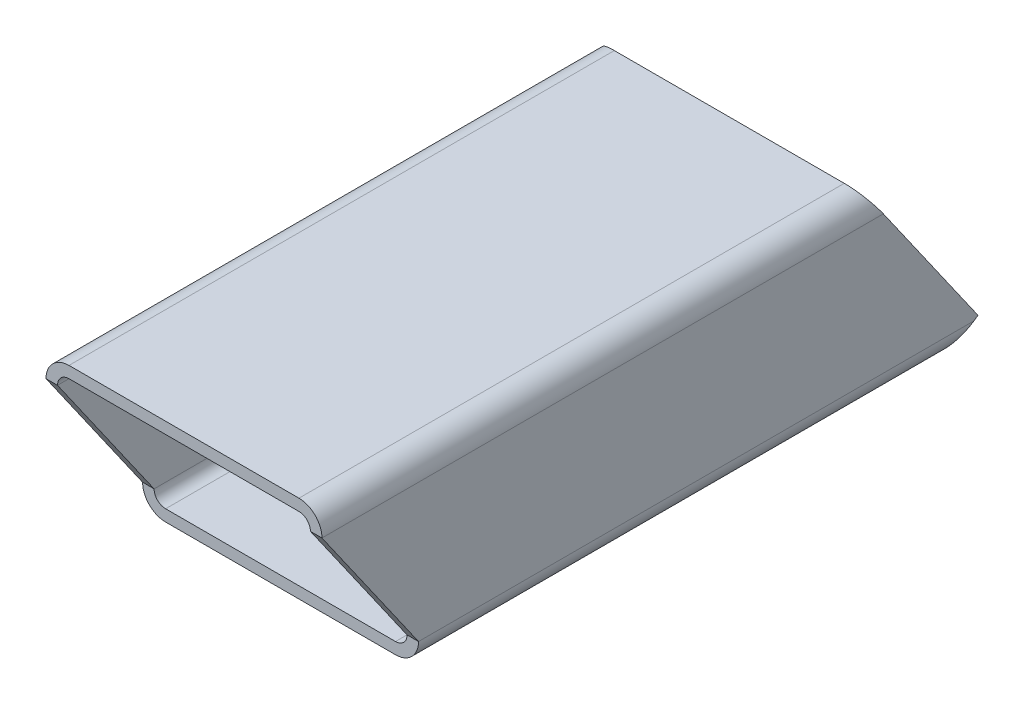
ISO-10303-21;
HEADER;
FILE_DESCRIPTION(('STEP AP214'),'2;1');
FILE_NAME('part.step','',(''),(''),'','','');
FILE_SCHEMA(('AUTOMOTIVE_DESIGN { 1 0 10303 214 1 1 1 1 }'));
ENDSEC;
DATA;
#1=APPLICATION_CONTEXT('core data for automotive mechanical design processes');
#2=APPLICATION_PROTOCOL_DEFINITION('international standard','automotive_design',2000,#1);
#3=PRODUCT_CONTEXT('',#1,'mechanical');
#4=PRODUCT('Part','Part','',(#3));
#5=PRODUCT_RELATED_PRODUCT_CATEGORY('part','',(#4));
#6=PRODUCT_DEFINITION_FORMATION('','',#4);
#7=PRODUCT_DEFINITION_CONTEXT('part definition',#1,'design');
#8=PRODUCT_DEFINITION('design','',#6,#7);
#9=PRODUCT_DEFINITION_SHAPE('','',#8);
#10=(LENGTH_UNIT() NAMED_UNIT(*) SI_UNIT(.MILLI.,.METRE.));
#11=(NAMED_UNIT(*) PLANE_ANGLE_UNIT() SI_UNIT($,.RADIAN.));
#12=(NAMED_UNIT(*) SI_UNIT($,.STERADIAN.) SOLID_ANGLE_UNIT());
#13=UNCERTAINTY_MEASURE_WITH_UNIT(LENGTH_MEASURE(1.E-05),#10,'distance_accuracy_value','');
#14=(GEOMETRIC_REPRESENTATION_CONTEXT(3) GLOBAL_UNCERTAINTY_ASSIGNED_CONTEXT((#13)) GLOBAL_UNIT_ASSIGNED_CONTEXT((#10,
#11,#12)) REPRESENTATION_CONTEXT('',''));
#15=CARTESIAN_POINT('',(0.,0.,0.));
#16=DIRECTION('',(0.,0.,1.));
#17=DIRECTION('',(1.,0.,0.));
#18=AXIS2_PLACEMENT_3D('',#15,#16,#17);
#19=CARTESIAN_POINT('',(63.5,-38.1,215.9));
#20=DIRECTION('',(0.,0.,-1.));
#21=DIRECTION('',(-1.,0.,0.));
#22=AXIS2_PLACEMENT_3D('',#19,#20,#21);
#23=CYLINDRICAL_SURFACE('',#22,12.7);
#24=DIRECTION('',(0.,0.,-1.));
#25=VECTOR('',#24,1.);
#26=CARTESIAN_POINT('',(63.5,-50.8,215.9));
#27=LINE('',#26,#25);
#28=CARTESIAN_POINT('',(63.5,-50.8,159.369185588421));
#29=VERTEX_POINT('',#28);
#30=CARTESIAN_POINT('',(63.5,-50.8,-129.26596489524));
#31=VERTEX_POINT('',#30);
#32=EDGE_CURVE('E240',#29,#31,#27,.T.);
#33=ORIENTED_EDGE('',*,*,#32,.T.);
#34=CARTESIAN_POINT('',(63.5,-38.1,-147.403444580865));
#35=DIRECTION('',(0.,0.819152044288994,0.573576436351042));
#36=DIRECTION('',(0.,0.573576436351042,-0.819152044288995));
#37=AXIS2_PLACEMENT_3D('',#34,#35,#36);
#38=ELLIPSE('',#37,22.1417743043881,12.7);
#39=CARTESIAN_POINT('',(76.2,-38.1,-147.403444580865));
#40=VERTEX_POINT('',#39);
#41=EDGE_CURVE('E305',#31,#40,#38,.T.);
#42=ORIENTED_EDGE('',*,*,#41,.T.);
#43=DIRECTION('',(0.,0.,-1.));
#44=VECTOR('',#43,1.);
#45=CARTESIAN_POINT('',(76.2,-38.1,215.9));
#46=LINE('',#45,#44);
#47=CARTESIAN_POINT('',(76.2,-38.1,159.369185588421));
#48=VERTEX_POINT('',#47);
#49=EDGE_CURVE('E255',#48,#40,#46,.T.);
#50=ORIENTED_EDGE('',*,*,#49,.F.);
#51=CARTESIAN_POINT('',(63.5,-38.1,159.369185588421));
#52=DIRECTION('',(0.,0.,-1.));
#53=DIRECTION('',(0.,1.,0.));
#54=AXIS2_PLACEMENT_3D('',#51,#52,#53);
#55=CIRCLE('',#54,12.7);
#56=EDGE_CURVE('E386',#48,#29,#55,.T.);
#57=ORIENTED_EDGE('',*,*,#56,.T.);
#58=EDGE_LOOP('',(#33,#42,#50,#57));
#59=FACE_BOUND('',#58,.T.);
#60=ADVANCED_FACE('F47',(#59),#23,.T.);
#61=CARTESIAN_POINT('',(76.2,-38.1,215.9));
#62=DIRECTION('',(-1.,0.,0.));
#63=DIRECTION('',(0.,0.,1.));
#64=AXIS2_PLACEMENT_3D('',#61,#62,#63);
#65=PLANE('',#64);
#66=ORIENTED_EDGE('',*,*,#49,.T.);
#67=DIRECTION('',(0.,0.573576436351042,-0.819152044288995));
#68=VECTOR('',#67,1.);
#69=CARTESIAN_POINT('',(76.2,-208.79678298937,96.3768258026976));
#70=LINE('',#69,#68);
#71=CARTESIAN_POINT('',(76.2,-36.5475735814158,-149.620539276179));
#72=VERTEX_POINT('',#71);
#73=EDGE_CURVE('E301',#40,#72,#70,.T.);
#74=ORIENTED_EDGE('',*,*,#73,.T.);
#75=DIRECTION('',(0.,-0.819152044288995,-0.573576436351042));
#76=VECTOR('',#75,1.);
#77=CARTESIAN_POINT('',(76.2,-85.4397277253834,-183.855194167096));
#78=LINE('',#77,#76);
#79=CARTESIAN_POINT('',(76.2,38.1,-97.3517455454086));
#80=VERTEX_POINT('',#79);
#81=EDGE_CURVE('E215',#80,#72,#78,.T.);
#82=ORIENTED_EDGE('',*,*,#81,.F.);
#83=DIRECTION('',(0.,0.,-1.));
#84=VECTOR('',#83,1.);
#85=CARTESIAN_POINT('',(76.2,38.1,215.9));
#86=LINE('',#85,#84);
#87=CARTESIAN_POINT('',(76.2,38.1,212.725));
#88=VERTEX_POINT('',#87);
#89=EDGE_CURVE('E251',#88,#80,#86,.T.);
#90=ORIENTED_EDGE('',*,*,#89,.F.);
#91=DIRECTION('',(0.,0.819152044288995,0.573576436351041));
#92=VECTOR('',#91,1.);
#93=CARTESIAN_POINT('',(76.2,-38.1,159.369185588421));
#94=LINE('',#93,#92);
#95=EDGE_CURVE('E335',#48,#88,#94,.T.);
#96=ORIENTED_EDGE('',*,*,#95,.F.);
#97=EDGE_LOOP('',(#66,#74,#82,#90,#96));
#98=FACE_BOUND('',#97,.T.);
#99=ADVANCED_FACE('F446',(#98),#65,.F.);
#100=CARTESIAN_POINT('',(63.5,38.1,215.9));
#101=DIRECTION('',(0.,0.,-1.));
#102=DIRECTION('',(-1.,0.,0.));
#103=AXIS2_PLACEMENT_3D('',#100,#101,#102);
#104=CYLINDRICAL_SURFACE('',#103,12.7);
#105=ORIENTED_EDGE('',*,*,#89,.T.);
#106=CARTESIAN_POINT('',(63.5,38.1,-97.3517455454086));
#107=DIRECTION('',(0.,-0.573576436351042,0.819152044288995));
#108=DIRECTION('',(0.,-0.819152044288995,-0.573576436351042));
#109=AXIS2_PLACEMENT_3D('',#106,#107,#108);
#110=ELLIPSE('',#109,15.5038372772704,12.7);
#111=CARTESIAN_POINT('',(63.5,50.8,-88.4591098101453));
#112=VERTEX_POINT('',#111);
#113=EDGE_CURVE('E331',#80,#112,#110,.T.);
#114=ORIENTED_EDGE('',*,*,#113,.T.);
#115=DIRECTION('',(0.,0.,-1.));
#116=VECTOR('',#115,1.);
#117=CARTESIAN_POINT('',(63.5,50.8,215.9));
#118=LINE('',#117,#116);
#119=CARTESIAN_POINT('',(63.5,50.8,212.725));
#120=VERTEX_POINT('',#119);
#121=EDGE_CURVE('E247',#120,#112,#118,.T.);
#122=ORIENTED_EDGE('',*,*,#121,.F.);
#123=CARTESIAN_POINT('',(63.5,38.1,212.725));
#124=DIRECTION('',(0.,0.,-1.));
#125=DIRECTION('',(0.,1.,0.));
#126=AXIS2_PLACEMENT_3D('',#123,#124,#125);
#127=CIRCLE('',#126,12.7);
#128=EDGE_CURVE('E368',#120,#88,#127,.T.);
#129=ORIENTED_EDGE('',*,*,#128,.T.);
#130=EDGE_LOOP('',(#105,#114,#122,#129));
#131=FACE_BOUND('',#130,.T.);
#132=ADVANCED_FACE('F442',(#131),#104,.T.);
#133=CARTESIAN_POINT('',(-63.5,50.8,215.9));
#134=DIRECTION('',(0.,-1.,0.));
#135=DIRECTION('',(0.,0.,-1.));
#136=AXIS2_PLACEMENT_3D('',#133,#134,#135);
#137=PLANE('',#136);
#138=ORIENTED_EDGE('',*,*,#121,.T.);
#139=DIRECTION('',(-1.,0.,0.));
#140=VECTOR('',#139,1.);
#141=CARTESIAN_POINT('',(-63.5,50.8,-88.4591098101453));
#142=LINE('',#141,#140);
#143=CARTESIAN_POINT('',(-63.5,50.8,-88.4591098101454));
#144=VERTEX_POINT('',#143);
#145=EDGE_CURVE('E327',#112,#144,#142,.T.);
#146=ORIENTED_EDGE('',*,*,#145,.T.);
#147=DIRECTION('',(0.,0.,-1.));
#148=VECTOR('',#147,1.);
#149=CARTESIAN_POINT('',(-63.5,50.8,215.9));
#150=LINE('',#149,#148);
#151=CARTESIAN_POINT('',(-63.5,50.8,212.725));
#152=VERTEX_POINT('',#151);
#153=EDGE_CURVE('E238',#152,#144,#150,.T.);
#154=ORIENTED_EDGE('',*,*,#153,.F.);
#155=DIRECTION('',(1.,0.,0.));
#156=VECTOR('',#155,1.);
#157=CARTESIAN_POINT('',(-76.2,50.8,212.725));
#158=LINE('',#157,#156);
#159=EDGE_CURVE('E343',#152,#120,#158,.T.);
#160=ORIENTED_EDGE('',*,*,#159,.T.);
#161=EDGE_LOOP('',(#138,#146,#154,#160));
#162=FACE_BOUND('',#161,.T.);
#163=ADVANCED_FACE('F439',(#162),#137,.F.);
#164=CARTESIAN_POINT('',(-63.5,38.1,215.9));
#165=DIRECTION('',(0.,0.,-1.));
#166=DIRECTION('',(-1.,0.,0.));
#167=AXIS2_PLACEMENT_3D('',#164,#165,#166);
#168=CYLINDRICAL_SURFACE('',#167,12.7);
#169=ORIENTED_EDGE('',*,*,#153,.T.);
#170=CARTESIAN_POINT('',(-63.5,38.1,-97.3517455454086));
#171=DIRECTION('',(0.,-0.573576436351042,0.819152044288995));
#172=DIRECTION('',(0.,-0.819152044288995,-0.573576436351042));
#173=AXIS2_PLACEMENT_3D('',#170,#171,#172);
#174=ELLIPSE('',#173,15.5038372772704,12.7);
#175=CARTESIAN_POINT('',(-76.2,38.1,-97.3517455454086));
#176=VERTEX_POINT('',#175);
#177=EDGE_CURVE('E324',#144,#176,#174,.T.);
#178=ORIENTED_EDGE('',*,*,#177,.T.);
#179=DIRECTION('',(0.,0.,-1.));
#180=VECTOR('',#179,1.);
#181=CARTESIAN_POINT('',(-76.2,38.1,215.9));
#182=LINE('',#181,#180);
#183=CARTESIAN_POINT('',(-76.2,38.1,212.725));
#184=VERTEX_POINT('',#183);
#185=EDGE_CURVE('E232',#184,#176,#182,.T.);
#186=ORIENTED_EDGE('',*,*,#185,.F.);
#187=CARTESIAN_POINT('',(-63.5,38.1,212.725));
#188=DIRECTION('',(0.,0.,-1.));
#189=DIRECTION('',(0.,1.,0.));
#190=AXIS2_PLACEMENT_3D('',#187,#188,#189);
#191=CIRCLE('',#190,12.7);
#192=EDGE_CURVE('E364',#184,#152,#191,.T.);
#193=ORIENTED_EDGE('',*,*,#192,.T.);
#194=EDGE_LOOP('',(#169,#178,#186,#193));
#195=FACE_BOUND('',#194,.T.);
#196=ADVANCED_FACE('F436',(#195),#168,.T.);
#197=CARTESIAN_POINT('',(-76.2,-38.1,215.9));
#198=DIRECTION('',(1.,0.,0.));
#199=DIRECTION('',(0.,0.,-1.));
#200=AXIS2_PLACEMENT_3D('',#197,#198,#199);
#201=PLANE('',#200);
#202=DIRECTION('',(0.,-0.819152044288995,-0.573576436351042));
#203=VECTOR('',#202,1.);
#204=CARTESIAN_POINT('',(-76.2,-85.4397277253834,-183.855194167096));
#205=LINE('',#204,#203);
#206=CARTESIAN_POINT('',(-76.2,-36.5475735814158,-149.620539276179));
#207=VERTEX_POINT('',#206);
#208=EDGE_CURVE('E224',#176,#207,#205,.T.);
#209=ORIENTED_EDGE('',*,*,#208,.T.);
#210=DIRECTION('',(0.,-0.573576436351042,0.819152044288995));
#211=VECTOR('',#210,1.);
#212=CARTESIAN_POINT('',(-76.2,-105.135311235006,-51.6670984592517));
#213=LINE('',#212,#211);
#214=CARTESIAN_POINT('',(-76.2,-38.1,-147.403444580864));
#215=VERTEX_POINT('',#214);
#216=EDGE_CURVE('E65',#207,#215,#213,.T.);
#217=ORIENTED_EDGE('',*,*,#216,.T.);
#218=DIRECTION('',(0.,0.,-1.));
#219=VECTOR('',#218,1.);
#220=CARTESIAN_POINT('',(-76.2,-38.1,215.9));
#221=LINE('',#220,#219);
#222=CARTESIAN_POINT('',(-76.2,-38.1,159.369185588421));
#223=VERTEX_POINT('',#222);
#224=EDGE_CURVE('E222',#223,#215,#221,.T.);
#225=ORIENTED_EDGE('',*,*,#224,.F.);
#226=DIRECTION('',(0.,0.819152044288995,0.573576436351041));
#227=VECTOR('',#226,1.);
#228=CARTESIAN_POINT('',(-76.2,-38.1,159.369185588421));
#229=LINE('',#228,#227);
#230=EDGE_CURVE('E339',#223,#184,#229,.T.);
#231=ORIENTED_EDGE('',*,*,#230,.T.);
#232=ORIENTED_EDGE('',*,*,#185,.T.);
#233=EDGE_LOOP('',(#209,#217,#225,#231,#232));
#234=FACE_BOUND('',#233,.T.);
#235=ADVANCED_FACE('F220',(#234),#201,.F.);
#236=CARTESIAN_POINT('',(-63.5,-38.1,215.9));
#237=DIRECTION('',(0.,0.,-1.));
#238=DIRECTION('',(-1.,0.,0.));
#239=AXIS2_PLACEMENT_3D('',#236,#237,#238);
#240=CYLINDRICAL_SURFACE('',#239,12.7);
#241=ORIENTED_EDGE('',*,*,#224,.T.);
#242=CARTESIAN_POINT('',(-63.5,-38.1,-147.403444580865));
#243=DIRECTION('',(0.,0.819152044288994,0.573576436351042));
#244=DIRECTION('',(0.,0.573576436351042,-0.819152044288995));
#245=AXIS2_PLACEMENT_3D('',#242,#243,#244);
#246=ELLIPSE('',#245,22.1417743043881,12.7);
#247=CARTESIAN_POINT('',(-63.5,-50.8,-129.265964895239));
#248=VERTEX_POINT('',#247);
#249=EDGE_CURVE('E206',#215,#248,#246,.T.);
#250=ORIENTED_EDGE('',*,*,#249,.T.);
#251=DIRECTION('',(0.,0.,-1.));
#252=VECTOR('',#251,1.);
#253=CARTESIAN_POINT('',(-63.5,-50.8,215.9));
#254=LINE('',#253,#252);
#255=CARTESIAN_POINT('',(-63.5,-50.8,159.369185588421));
#256=VERTEX_POINT('',#255);
#257=EDGE_CURVE('E233',#256,#248,#254,.T.);
#258=ORIENTED_EDGE('',*,*,#257,.F.);
#259=CARTESIAN_POINT('',(-63.5,-38.1,159.369185588421));
#260=DIRECTION('',(0.,0.,-1.));
#261=DIRECTION('',(0.,1.,0.));
#262=AXIS2_PLACEMENT_3D('',#259,#260,#261);
#263=CIRCLE('',#262,12.7);
#264=EDGE_CURVE('E230',#256,#223,#263,.T.);
#265=ORIENTED_EDGE('',*,*,#264,.T.);
#266=EDGE_LOOP('',(#241,#250,#258,#265));
#267=FACE_BOUND('',#266,.T.);
#268=ADVANCED_FACE('F229',(#267),#240,.T.);
#269=CARTESIAN_POINT('',(-63.5,-50.8,215.9));
#270=DIRECTION('',(0.,1.,0.));
#271=DIRECTION('',(0.,0.,1.));
#272=AXIS2_PLACEMENT_3D('',#269,#270,#271);
#273=PLANE('',#272);
#274=ORIENTED_EDGE('',*,*,#257,.T.);
#275=DIRECTION('',(1.,0.,0.));
#276=VECTOR('',#275,1.);
#277=CARTESIAN_POINT('',(-63.5,-50.8,-129.265964895239));
#278=LINE('',#277,#276);
#279=EDGE_CURVE('E209',#248,#31,#278,.T.);
#280=ORIENTED_EDGE('',*,*,#279,.T.);
#281=ORIENTED_EDGE('',*,*,#32,.F.);
#282=DIRECTION('',(1.,0.,0.));
#283=VECTOR('',#282,1.);
#284=CARTESIAN_POINT('',(-76.2,-50.8,159.369185588421));
#285=LINE('',#284,#283);
#286=EDGE_CURVE('E342',#256,#29,#285,.T.);
#287=ORIENTED_EDGE('',*,*,#286,.F.);
#288=EDGE_LOOP('',(#274,#280,#281,#287));
#289=FACE_BOUND('',#288,.T.);
#290=ADVANCED_FACE('F424',(#289),#273,.F.);
#291=CARTESIAN_POINT('',(-63.5,38.1,215.9));
#292=DIRECTION('',(0.,0.,-1.));
#293=DIRECTION('',(-1.,0.,0.));
#294=AXIS2_PLACEMENT_3D('',#291,#292,#293);
#295=CYLINDRICAL_SURFACE('',#294,6.35);
#296=CARTESIAN_POINT('',(-63.5,38.1,-97.3517455454086));
#297=DIRECTION('',(0.,-0.573576436351042,0.819152044288995));
#298=DIRECTION('',(0.,-0.819152044288995,-0.573576436351042));
#299=AXIS2_PLACEMENT_3D('',#296,#297,#298);
#300=ELLIPSE('',#299,7.75191863863522,6.35);
#301=CARTESIAN_POINT('',(-63.5,44.45,-92.905427677777));
#302=VERTEX_POINT('',#301);
#303=CARTESIAN_POINT('',(-69.85,38.1,-97.3517455454086));
#304=VERTEX_POINT('',#303);
#305=EDGE_CURVE('E322',#302,#304,#300,.T.);
#306=ORIENTED_EDGE('',*,*,#305,.F.);
#307=DIRECTION('',(0.,0.,-1.));
#308=VECTOR('',#307,1.);
#309=CARTESIAN_POINT('',(-63.5,44.45,215.9));
#310=LINE('',#309,#308);
#311=CARTESIAN_POINT('',(-63.5,44.45,212.725));
#312=VERTEX_POINT('',#311);
#313=EDGE_CURVE('E390',#312,#302,#310,.T.);
#314=ORIENTED_EDGE('',*,*,#313,.F.);
#315=CARTESIAN_POINT('',(-63.5,38.1,212.725));
#316=DIRECTION('',(0.,0.,-1.));
#317=DIRECTION('',(0.,1.,0.));
#318=AXIS2_PLACEMENT_3D('',#315,#316,#317);
#319=CIRCLE('',#318,6.35);
#320=CARTESIAN_POINT('',(-69.85,38.1,212.725));
#321=VERTEX_POINT('',#320);
#322=EDGE_CURVE('E361',#321,#312,#319,.T.);
#323=ORIENTED_EDGE('',*,*,#322,.F.);
#324=DIRECTION('',(0.,0.,-1.));
#325=VECTOR('',#324,1.);
#326=CARTESIAN_POINT('',(-69.85,38.1,215.9));
#327=LINE('',#326,#325);
#328=EDGE_CURVE('E415',#321,#304,#327,.T.);
#329=ORIENTED_EDGE('',*,*,#328,.T.);
#330=EDGE_LOOP('',(#306,#314,#323,#329));
#331=FACE_BOUND('',#330,.T.);
#332=ADVANCED_FACE('F465',(#331),#295,.F.);
#333=CARTESIAN_POINT('',(-69.85,-38.1,215.9));
#334=DIRECTION('',(1.,0.,0.));
#335=DIRECTION('',(0.,1.,0.));
#336=AXIS2_PLACEMENT_3D('',#333,#334,#335);
#337=PLANE('',#336);
#338=DIRECTION('',(0.,-0.573576436351042,0.819152044288995));
#339=VECTOR('',#338,1.);
#340=CARTESIAN_POINT('',(-69.85,-208.79678298937,96.3768258026976));
#341=LINE('',#340,#339);
#342=CARTESIAN_POINT('',(-69.85,-36.5475735814158,-149.620539276179));
#343=VERTEX_POINT('',#342);
#344=CARTESIAN_POINT('',(-69.85,-38.1,-147.403444580865));
#345=VERTEX_POINT('',#344);
#346=EDGE_CURVE('E226',#343,#345,#341,.T.);
#347=ORIENTED_EDGE('',*,*,#346,.F.);
#348=DIRECTION('',(0.,-0.819152044288995,-0.573576436351042));
#349=VECTOR('',#348,1.);
#350=CARTESIAN_POINT('',(-69.85,134.149209407954,-30.0973650788771));
#351=LINE('',#350,#349);
#352=EDGE_CURVE('E276',#304,#343,#351,.T.);
#353=ORIENTED_EDGE('',*,*,#352,.F.);
#354=ORIENTED_EDGE('',*,*,#328,.F.);
#355=DIRECTION('',(0.,0.819152044288995,0.573576436351042));
#356=VECTOR('',#355,1.);
#357=CARTESIAN_POINT('',(-69.85,-11.5392054252108,177.967254170527));
#358=LINE('',#357,#356);
#359=CARTESIAN_POINT('',(-69.85,-38.1,159.369185588421));
#360=VERTEX_POINT('',#359);
#361=EDGE_CURVE('E375',#360,#321,#358,.T.);
#362=ORIENTED_EDGE('',*,*,#361,.F.);
#363=DIRECTION('',(0.,0.,-1.));
#364=VECTOR('',#363,1.);
#365=CARTESIAN_POINT('',(-69.85,-38.1,215.9));
#366=LINE('',#365,#364);
#367=EDGE_CURVE('E286',#360,#345,#366,.T.);
#368=ORIENTED_EDGE('',*,*,#367,.T.);
#369=EDGE_LOOP('',(#347,#353,#354,#362,#368));
#370=FACE_BOUND('',#369,.T.);
#371=ADVANCED_FACE('F281',(#370),#337,.T.);
#372=CARTESIAN_POINT('',(-63.5,-38.1,215.9));
#373=DIRECTION('',(0.,0.,-1.));
#374=DIRECTION('',(-1.,0.,0.));
#375=AXIS2_PLACEMENT_3D('',#372,#373,#374);
#376=CYLINDRICAL_SURFACE('',#375,6.35);
#377=CARTESIAN_POINT('',(-63.5,-38.1,-147.403444580865));
#378=DIRECTION('',(0.,0.819152044288994,0.573576436351042));
#379=DIRECTION('',(0.,0.573576436351042,-0.819152044288995));
#380=AXIS2_PLACEMENT_3D('',#377,#378,#379);
#381=ELLIPSE('',#380,11.070887152194,6.35);
#382=CARTESIAN_POINT('',(-63.5,-44.45,-138.334704738052));
#383=VERTEX_POINT('',#382);
#384=EDGE_CURVE('E287',#345,#383,#381,.T.);
#385=ORIENTED_EDGE('',*,*,#384,.F.);
#386=ORIENTED_EDGE('',*,*,#367,.F.);
#387=CARTESIAN_POINT('',(-63.5,-38.1,159.369185588421));
#388=DIRECTION('',(0.,0.,-1.));
#389=DIRECTION('',(0.,1.,0.));
#390=AXIS2_PLACEMENT_3D('',#387,#388,#389);
#391=CIRCLE('',#390,6.35);
#392=CARTESIAN_POINT('',(-63.5,-44.45,159.369185588421));
#393=VERTEX_POINT('',#392);
#394=EDGE_CURVE('E381',#393,#360,#391,.T.);
#395=ORIENTED_EDGE('',*,*,#394,.F.);
#396=DIRECTION('',(0.,0.,-1.));
#397=VECTOR('',#396,1.);
#398=CARTESIAN_POINT('',(-63.5,-44.45,215.9));
#399=LINE('',#398,#397);
#400=EDGE_CURVE('E410',#393,#383,#399,.T.);
#401=ORIENTED_EDGE('',*,*,#400,.T.);
#402=EDGE_LOOP('',(#385,#386,#395,#401));
#403=FACE_BOUND('',#402,.T.);
#404=ADVANCED_FACE('F467',(#403),#376,.F.);
#405=CARTESIAN_POINT('',(-63.5,-44.45,215.9));
#406=DIRECTION('',(0.,1.,0.));
#407=DIRECTION('',(0.,0.,1.));
#408=AXIS2_PLACEMENT_3D('',#405,#406,#407);
#409=PLANE('',#408);
#410=DIRECTION('',(1.,0.,0.));
#411=VECTOR('',#410,1.);
#412=CARTESIAN_POINT('',(-63.5,-44.45,-138.334704738052));
#413=LINE('',#412,#411);
#414=CARTESIAN_POINT('',(63.5,-44.45,-138.334704738052));
#415=VERTEX_POINT('',#414);
#416=EDGE_CURVE('E291',#383,#415,#413,.T.);
#417=ORIENTED_EDGE('',*,*,#416,.F.);
#418=ORIENTED_EDGE('',*,*,#400,.F.);
#419=DIRECTION('',(-1.,0.,0.));
#420=VECTOR('',#419,1.);
#421=CARTESIAN_POINT('',(-63.5,-44.45,159.369185588421));
#422=LINE('',#421,#420);
#423=CARTESIAN_POINT('',(63.5,-44.45,159.369185588421));
#424=VERTEX_POINT('',#423);
#425=EDGE_CURVE('E378',#424,#393,#422,.T.);
#426=ORIENTED_EDGE('',*,*,#425,.F.);
#427=DIRECTION('',(0.,0.,-1.));
#428=VECTOR('',#427,1.);
#429=CARTESIAN_POINT('',(63.5,-44.45,215.9));
#430=LINE('',#429,#428);
#431=EDGE_CURVE('E406',#424,#415,#430,.T.);
#432=ORIENTED_EDGE('',*,*,#431,.T.);
#433=EDGE_LOOP('',(#417,#418,#426,#432));
#434=FACE_BOUND('',#433,.T.);
#435=ADVANCED_FACE('F472',(#434),#409,.T.);
#436=CARTESIAN_POINT('',(63.5,-38.1,215.9));
#437=DIRECTION('',(0.,0.,-1.));
#438=DIRECTION('',(-1.,0.,0.));
#439=AXIS2_PLACEMENT_3D('',#436,#437,#438);
#440=CYLINDRICAL_SURFACE('',#439,6.35);
#441=CARTESIAN_POINT('',(63.5,-38.1,-147.403444580865));
#442=DIRECTION('',(0.,0.819152044288994,0.573576436351042));
#443=DIRECTION('',(0.,0.573576436351042,-0.819152044288995));
#444=AXIS2_PLACEMENT_3D('',#441,#442,#443);
#445=ELLIPSE('',#444,11.0708871521941,6.35);
#446=CARTESIAN_POINT('',(69.85,-38.1,-147.403444580865));
#447=VERTEX_POINT('',#446);
#448=EDGE_CURVE('E296',#415,#447,#445,.T.);
#449=ORIENTED_EDGE('',*,*,#448,.F.);
#450=ORIENTED_EDGE('',*,*,#431,.F.);
#451=CARTESIAN_POINT('',(63.5,-38.1,159.369185588421));
#452=DIRECTION('',(0.,0.,-1.));
#453=DIRECTION('',(0.,1.,0.));
#454=AXIS2_PLACEMENT_3D('',#451,#452,#453);
#455=CIRCLE('',#454,6.35);
#456=CARTESIAN_POINT('',(69.85,-38.1,159.369185588421));
#457=VERTEX_POINT('',#456);
#458=EDGE_CURVE('E262',#457,#424,#455,.T.);
#459=ORIENTED_EDGE('',*,*,#458,.F.);
#460=DIRECTION('',(0.,0.,-1.));
#461=VECTOR('',#460,1.);
#462=CARTESIAN_POINT('',(69.85,-38.1,215.9));
#463=LINE('',#462,#461);
#464=EDGE_CURVE('E402',#457,#447,#463,.T.);
#465=ORIENTED_EDGE('',*,*,#464,.T.);
#466=EDGE_LOOP('',(#449,#450,#459,#465));
#467=FACE_BOUND('',#466,.T.);
#468=ADVANCED_FACE('F477',(#467),#440,.F.);
#469=CARTESIAN_POINT('',(69.85,-38.1,215.9));
#470=DIRECTION('',(-1.,0.,0.));
#471=DIRECTION('',(0.,-1.,0.));
#472=AXIS2_PLACEMENT_3D('',#469,#470,#471);
#473=PLANE('',#472);
#474=DIRECTION('',(0.,0.573576436351042,-0.819152044288995));
#475=VECTOR('',#474,1.);
#476=CARTESIAN_POINT('',(69.85,-208.79678298937,96.3768258026976));
#477=LINE('',#476,#475);
#478=CARTESIAN_POINT('',(69.85,-36.5475735814157,-149.620539276179));
#479=VERTEX_POINT('',#478);
#480=EDGE_CURVE('E299',#447,#479,#477,.T.);
#481=ORIENTED_EDGE('',*,*,#480,.F.);
#482=ORIENTED_EDGE('',*,*,#464,.F.);
#483=DIRECTION('',(0.,-0.819152044288995,-0.573576436351042));
#484=VECTOR('',#483,1.);
#485=CARTESIAN_POINT('',(69.85,-11.5392054252108,177.967254170527));
#486=LINE('',#485,#484);
#487=CARTESIAN_POINT('',(69.8499999999999,38.1,212.725));
#488=VERTEX_POINT('',#487);
#489=EDGE_CURVE('E372',#488,#457,#486,.T.);
#490=ORIENTED_EDGE('',*,*,#489,.F.);
#491=DIRECTION('',(0.,0.,-1.));
#492=VECTOR('',#491,1.);
#493=CARTESIAN_POINT('',(69.85,38.1,215.9));
#494=LINE('',#493,#492);
#495=CARTESIAN_POINT('',(69.85,38.1,-97.3517455454086));
#496=VERTEX_POINT('',#495);
#497=EDGE_CURVE('E398',#488,#496,#494,.T.);
#498=ORIENTED_EDGE('',*,*,#497,.T.);
#499=DIRECTION('',(0.,0.819152044288995,0.573576436351042));
#500=VECTOR('',#499,1.);
#501=CARTESIAN_POINT('',(69.85,134.149209407954,-30.0973650788771));
#502=LINE('',#501,#500);
#503=EDGE_CURVE('E317',#479,#496,#502,.T.);
#504=ORIENTED_EDGE('',*,*,#503,.F.);
#505=EDGE_LOOP('',(#481,#482,#490,#498,#504));
#506=FACE_BOUND('',#505,.T.);
#507=ADVANCED_FACE('F451',(#506),#473,.T.);
#508=CARTESIAN_POINT('',(63.5,38.1,215.9));
#509=DIRECTION('',(0.,0.,-1.));
#510=DIRECTION('',(-1.,0.,0.));
#511=AXIS2_PLACEMENT_3D('',#508,#509,#510);
#512=CYLINDRICAL_SURFACE('',#511,6.35);
#513=CARTESIAN_POINT('',(63.5,38.1,-97.3517455454086));
#514=DIRECTION('',(0.,-0.573576436351042,0.819152044288995));
#515=DIRECTION('',(0.,-0.819152044288995,-0.573576436351042));
#516=AXIS2_PLACEMENT_3D('',#513,#514,#515);
#517=ELLIPSE('',#516,7.75191863863521,6.35);
#518=CARTESIAN_POINT('',(63.5,44.45,-92.905427677777));
#519=VERTEX_POINT('',#518);
#520=EDGE_CURVE('E76',#496,#519,#517,.T.);
#521=ORIENTED_EDGE('',*,*,#520,.F.);
#522=ORIENTED_EDGE('',*,*,#497,.F.);
#523=CARTESIAN_POINT('',(63.5,38.1,212.725));
#524=DIRECTION('',(0.,0.,-1.));
#525=DIRECTION('',(0.,1.,0.));
#526=AXIS2_PLACEMENT_3D('',#523,#524,#525);
#527=CIRCLE('',#526,6.35);
#528=CARTESIAN_POINT('',(63.5,44.45,212.725));
#529=VERTEX_POINT('',#528);
#530=EDGE_CURVE('E346',#529,#488,#527,.T.);
#531=ORIENTED_EDGE('',*,*,#530,.F.);
#532=DIRECTION('',(0.,0.,-1.));
#533=VECTOR('',#532,1.);
#534=CARTESIAN_POINT('',(63.5,44.45,215.9));
#535=LINE('',#534,#533);
#536=EDGE_CURVE('E394',#529,#519,#535,.T.);
#537=ORIENTED_EDGE('',*,*,#536,.T.);
#538=EDGE_LOOP('',(#521,#522,#531,#537));
#539=FACE_BOUND('',#538,.T.);
#540=ADVANCED_FACE('F457',(#539),#512,.F.);
#541=CARTESIAN_POINT('',(-63.5,44.45,215.9));
#542=DIRECTION('',(0.,-1.,0.));
#543=DIRECTION('',(0.,0.,-1.));
#544=AXIS2_PLACEMENT_3D('',#541,#542,#543);
#545=PLANE('',#544);
#546=DIRECTION('',(-1.,0.,0.));
#547=VECTOR('',#546,1.);
#548=CARTESIAN_POINT('',(-63.5,44.45,-92.905427677777));
#549=LINE('',#548,#547);
#550=EDGE_CURVE('E264',#519,#302,#549,.T.);
#551=ORIENTED_EDGE('',*,*,#550,.F.);
#552=ORIENTED_EDGE('',*,*,#536,.F.);
#553=DIRECTION('',(1.,0.,0.));
#554=VECTOR('',#553,1.);
#555=CARTESIAN_POINT('',(-63.5,44.45,212.725));
#556=LINE('',#555,#554);
#557=EDGE_CURVE('E259',#312,#529,#556,.T.);
#558=ORIENTED_EDGE('',*,*,#557,.F.);
#559=ORIENTED_EDGE('',*,*,#313,.T.);
#560=EDGE_LOOP('',(#551,#552,#558,#559));
#561=FACE_BOUND('',#560,.T.);
#562=ADVANCED_FACE('F461',(#561),#545,.T.);
#563=CARTESIAN_POINT('',(-76.2,-50.8,159.369185588421));
#564=DIRECTION('',(0.,0.,-1.));
#565=DIRECTION('',(0.,1.,0.));
#566=AXIS2_PLACEMENT_3D('',#563,#564,#565);
#567=PLANE('',#566);
#568=DIRECTION('',(1.,0.,0.));
#569=VECTOR('',#568,1.);
#570=CARTESIAN_POINT('',(-76.2,-38.1,159.369185588421));
#571=LINE('',#570,#569);
#572=EDGE_CURVE('E356',#457,#48,#571,.T.);
#573=ORIENTED_EDGE('',*,*,#572,.F.);
#574=ORIENTED_EDGE('',*,*,#458,.T.);
#575=ORIENTED_EDGE('',*,*,#425,.T.);
#576=ORIENTED_EDGE('',*,*,#394,.T.);
#577=EDGE_CURVE('E352',#223,#360,#571,.T.);
#578=ORIENTED_EDGE('',*,*,#577,.F.);
#579=ORIENTED_EDGE('',*,*,#264,.F.);
#580=ORIENTED_EDGE('',*,*,#286,.T.);
#581=ORIENTED_EDGE('',*,*,#56,.F.);
#582=EDGE_LOOP('',(#573,#574,#575,#576,#578,#579,#580,#581));
#583=FACE_BOUND('',#582,.T.);
#584=ADVANCED_FACE('F427',(#583),#567,.F.);
#585=CARTESIAN_POINT('',(-76.2,-38.1,159.369185588421));
#586=DIRECTION('',(0.,0.573576436351041,-0.819152044288995));
#587=DIRECTION('',(0.,0.819152044288995,0.573576436351042));
#588=AXIS2_PLACEMENT_3D('',#585,#586,#587);
#589=PLANE('',#588);
#590=ORIENTED_EDGE('',*,*,#361,.T.);
#591=DIRECTION('',(1.,0.,0.));
#592=VECTOR('',#591,1.);
#593=CARTESIAN_POINT('',(-76.2,38.1,212.725));
#594=LINE('',#593,#592);
#595=EDGE_CURVE('E347',#184,#321,#594,.T.);
#596=ORIENTED_EDGE('',*,*,#595,.F.);
#597=ORIENTED_EDGE('',*,*,#230,.F.);
#598=ORIENTED_EDGE('',*,*,#577,.T.);
#599=EDGE_LOOP('',(#590,#596,#597,#598));
#600=FACE_BOUND('',#599,.T.);
#601=ADVANCED_FACE('F433',(#600),#589,.F.);
#602=CARTESIAN_POINT('',(-76.2,38.1,212.725));
#603=DIRECTION('',(0.,0.,-1.));
#604=DIRECTION('',(0.,1.,0.));
#605=AXIS2_PLACEMENT_3D('',#602,#603,#604);
#606=PLANE('',#605);
#607=ORIENTED_EDGE('',*,*,#159,.F.);
#608=ORIENTED_EDGE('',*,*,#192,.F.);
#609=ORIENTED_EDGE('',*,*,#595,.T.);
#610=ORIENTED_EDGE('',*,*,#322,.T.);
#611=ORIENTED_EDGE('',*,*,#557,.T.);
#612=ORIENTED_EDGE('',*,*,#530,.T.);
#613=EDGE_CURVE('E351',#488,#88,#594,.T.);
#614=ORIENTED_EDGE('',*,*,#613,.T.);
#615=ORIENTED_EDGE('',*,*,#128,.F.);
#616=EDGE_LOOP('',(#607,#608,#609,#610,#611,#612,#614,#615));
#617=FACE_BOUND('',#616,.T.);
#618=ADVANCED_FACE('F483',(#617),#606,.F.);
#619=ORIENTED_EDGE('',*,*,#489,.T.);
#620=ORIENTED_EDGE('',*,*,#572,.T.);
#621=ORIENTED_EDGE('',*,*,#95,.T.);
#622=ORIENTED_EDGE('',*,*,#613,.F.);
#623=EDGE_LOOP('',(#619,#620,#621,#622));
#624=FACE_BOUND('',#623,.T.);
#625=ADVANCED_FACE('F484',(#624),#589,.F.);
#626=CARTESIAN_POINT('',(-76.2,-85.4397277253834,-183.855194167096));
#627=DIRECTION('',(0.,-0.573576436351042,0.819152044288995));
#628=DIRECTION('',(0.,-0.819152044288995,-0.573576436351042));
#629=AXIS2_PLACEMENT_3D('',#626,#627,#628);
#630=PLANE('',#629);
#631=ORIENTED_EDGE('',*,*,#81,.T.);
#632=DIRECTION('',(-1.,0.,0.));
#633=VECTOR('',#632,1.);
#634=CARTESIAN_POINT('',(-76.2,-36.5475735814158,-149.620539276179));
#635=LINE('',#634,#633);
#636=EDGE_CURVE('E11',#72,#479,#635,.T.);
#637=ORIENTED_EDGE('',*,*,#636,.T.);
#638=ORIENTED_EDGE('',*,*,#503,.T.);
#639=ORIENTED_EDGE('',*,*,#520,.T.);
#640=ORIENTED_EDGE('',*,*,#550,.T.);
#641=ORIENTED_EDGE('',*,*,#305,.T.);
#642=ORIENTED_EDGE('',*,*,#352,.T.);
#643=EDGE_CURVE('E50',#343,#207,#635,.T.);
#644=ORIENTED_EDGE('',*,*,#643,.T.);
#645=ORIENTED_EDGE('',*,*,#208,.F.);
#646=ORIENTED_EDGE('',*,*,#177,.F.);
#647=ORIENTED_EDGE('',*,*,#145,.F.);
#648=ORIENTED_EDGE('',*,*,#113,.F.);
#649=EDGE_LOOP('',(#631,#637,#638,#639,#640,#641,#642,#644,#645,#646,#647,#648));
#650=FACE_BOUND('',#649,.T.);
#651=ADVANCED_FACE('F273',(#650),#630,.F.);
#652=CARTESIAN_POINT('',(-76.2,-105.135311235006,-51.6670984592517));
#653=DIRECTION('',(0.,0.819152044288994,0.573576436351042));
#654=DIRECTION('',(0.,-0.573576436351042,0.819152044288995));
#655=AXIS2_PLACEMENT_3D('',#652,#653,#654);
#656=PLANE('',#655);
#657=ORIENTED_EDGE('',*,*,#216,.F.);
#658=ORIENTED_EDGE('',*,*,#643,.F.);
#659=ORIENTED_EDGE('',*,*,#346,.T.);
#660=ORIENTED_EDGE('',*,*,#384,.T.);
#661=ORIENTED_EDGE('',*,*,#416,.T.);
#662=ORIENTED_EDGE('',*,*,#448,.T.);
#663=ORIENTED_EDGE('',*,*,#480,.T.);
#664=ORIENTED_EDGE('',*,*,#636,.F.);
#665=ORIENTED_EDGE('',*,*,#73,.F.);
#666=ORIENTED_EDGE('',*,*,#41,.F.);
#667=ORIENTED_EDGE('',*,*,#279,.F.);
#668=ORIENTED_EDGE('',*,*,#249,.F.);
#669=EDGE_LOOP('',(#657,#658,#659,#660,#661,#662,#663,#664,#665,#666,#667,#668));
#670=FACE_BOUND('',#669,.T.);
#671=ADVANCED_FACE('F207',(#670),#656,.F.);
#672=CLOSED_SHELL('',(#60,#99,#132,#163,#196,#235,#268,#290,#332,#371,#404,#435,#468,#507,#540,
#562,#584,#601,#618,#625,#651,#671));
#673=MANIFOLD_SOLID_BREP('B2',#672);
#674=ADVANCED_BREP_SHAPE_REPRESENTATION('',(#18,#673),#14);
#675=SHAPE_DEFINITION_REPRESENTATION(#9,#674);
ENDSEC;
END-ISO-10303-21;
